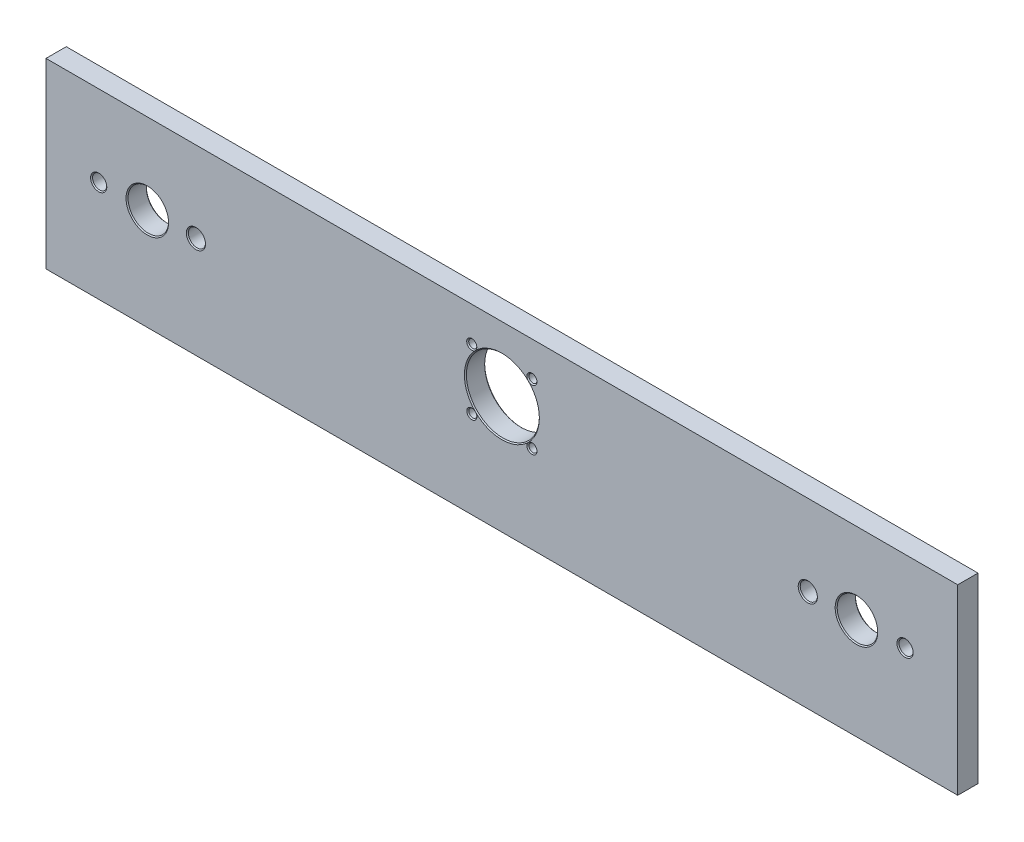
ISO-10303-21;
HEADER;
FILE_DESCRIPTION(('STEP AP214'),'2;1');
FILE_NAME('part.step','',(''),(''),'','','');
FILE_SCHEMA(('AUTOMOTIVE_DESIGN { 1 0 10303 214 1 1 1 1 }'));
ENDSEC;
DATA;
#1=APPLICATION_CONTEXT('core data for automotive mechanical design processes');
#2=APPLICATION_PROTOCOL_DEFINITION('international standard','automotive_design',2000,#1);
#3=PRODUCT_CONTEXT('',#1,'mechanical');
#4=PRODUCT('Part','Part','',(#3));
#5=PRODUCT_RELATED_PRODUCT_CATEGORY('part','',(#4));
#6=PRODUCT_DEFINITION_FORMATION('','',#4);
#7=PRODUCT_DEFINITION_CONTEXT('part definition',#1,'design');
#8=PRODUCT_DEFINITION('design','',#6,#7);
#9=PRODUCT_DEFINITION_SHAPE('','',#8);
#10=(LENGTH_UNIT() NAMED_UNIT(*) SI_UNIT(.MILLI.,.METRE.));
#11=(NAMED_UNIT(*) PLANE_ANGLE_UNIT() SI_UNIT($,.RADIAN.));
#12=(NAMED_UNIT(*) SI_UNIT($,.STERADIAN.) SOLID_ANGLE_UNIT());
#13=UNCERTAINTY_MEASURE_WITH_UNIT(LENGTH_MEASURE(1.E-05),#10,'distance_accuracy_value','');
#14=(GEOMETRIC_REPRESENTATION_CONTEXT(3) GLOBAL_UNCERTAINTY_ASSIGNED_CONTEXT((#13)) GLOBAL_UNIT_ASSIGNED_CONTEXT((#10,
#11,#12)) REPRESENTATION_CONTEXT('',''));
#15=CARTESIAN_POINT('',(0.,0.,0.));
#16=DIRECTION('',(0.,0.,1.));
#17=DIRECTION('',(1.,0.,0.));
#18=AXIS2_PLACEMENT_3D('',#15,#16,#17);
#19=CARTESIAN_POINT('',(0.,0.,10.));
#20=DIRECTION('',(1.,0.,0.));
#21=DIRECTION('',(0.,1.,0.));
#22=AXIS2_PLACEMENT_3D('',#19,#20,#21);
#23=PLANE('',#22);
#24=DIRECTION('',(0.,-1.,0.));
#25=VECTOR('',#24,1.);
#26=CARTESIAN_POINT('',(0.,0.,0.));
#27=LINE('',#26,#25);
#28=CARTESIAN_POINT('',(0.,89.9999999999999,0.));
#29=VERTEX_POINT('',#28);
#30=CARTESIAN_POINT('',(0.,0.,0.));
#31=VERTEX_POINT('',#30);
#32=EDGE_CURVE('E151',#29,#31,#27,.T.);
#33=ORIENTED_EDGE('',*,*,#32,.T.);
#34=DIRECTION('',(0.,0.,-1.));
#35=VECTOR('',#34,1.);
#36=CARTESIAN_POINT('',(0.,0.,10.));
#37=LINE('',#36,#35);
#38=CARTESIAN_POINT('',(0.,0.,10.));
#39=VERTEX_POINT('',#38);
#40=EDGE_CURVE('E132',#39,#31,#37,.T.);
#41=ORIENTED_EDGE('',*,*,#40,.F.);
#42=DIRECTION('',(0.,-1.,0.));
#43=VECTOR('',#42,1.);
#44=CARTESIAN_POINT('',(0.,0.,10.));
#45=LINE('',#44,#43);
#46=CARTESIAN_POINT('',(0.,89.9999999999999,10.));
#47=VERTEX_POINT('',#46);
#48=EDGE_CURVE('E139',#47,#39,#45,.T.);
#49=ORIENTED_EDGE('',*,*,#48,.F.);
#50=DIRECTION('',(0.,0.,-1.));
#51=VECTOR('',#50,1.);
#52=CARTESIAN_POINT('',(0.,89.9999999999999,10.));
#53=LINE('',#52,#51);
#54=EDGE_CURVE('E436',#47,#29,#53,.T.);
#55=ORIENTED_EDGE('',*,*,#54,.T.);
#56=EDGE_LOOP('',(#33,#41,#49,#55));
#57=FACE_BOUND('',#56,.T.);
#58=ADVANCED_FACE('F32',(#57),#23,.F.);
#59=CARTESIAN_POINT('',(0.,0.,10.));
#60=DIRECTION('',(0.,1.,0.));
#61=DIRECTION('',(-1.,0.,0.));
#62=AXIS2_PLACEMENT_3D('',#59,#60,#61);
#63=PLANE('',#62);
#64=DIRECTION('',(1.,0.,0.));
#65=VECTOR('',#64,1.);
#66=CARTESIAN_POINT('',(0.,0.,0.));
#67=LINE('',#66,#65);
#68=CARTESIAN_POINT('',(450.,0.,0.));
#69=VERTEX_POINT('',#68);
#70=EDGE_CURVE('E427',#31,#69,#67,.T.);
#71=ORIENTED_EDGE('',*,*,#70,.T.);
#72=DIRECTION('',(0.,0.,-1.));
#73=VECTOR('',#72,1.);
#74=CARTESIAN_POINT('',(450.,0.,10.));
#75=LINE('',#74,#73);
#76=CARTESIAN_POINT('',(450.,0.,10.));
#77=VERTEX_POINT('',#76);
#78=EDGE_CURVE('E135',#77,#69,#75,.T.);
#79=ORIENTED_EDGE('',*,*,#78,.F.);
#80=DIRECTION('',(1.,0.,0.));
#81=VECTOR('',#80,1.);
#82=CARTESIAN_POINT('',(0.,0.,10.));
#83=LINE('',#82,#81);
#84=EDGE_CURVE('E128',#39,#77,#83,.T.);
#85=ORIENTED_EDGE('',*,*,#84,.F.);
#86=ORIENTED_EDGE('',*,*,#40,.T.);
#87=EDGE_LOOP('',(#71,#79,#85,#86));
#88=FACE_BOUND('',#87,.T.);
#89=ADVANCED_FACE('F130',(#88),#63,.F.);
#90=CARTESIAN_POINT('',(450.,0.,10.));
#91=DIRECTION('',(-1.,0.,0.));
#92=DIRECTION('',(0.,-1.,0.));
#93=AXIS2_PLACEMENT_3D('',#90,#91,#92);
#94=PLANE('',#93);
#95=DIRECTION('',(0.,1.,0.));
#96=VECTOR('',#95,1.);
#97=CARTESIAN_POINT('',(450.,0.,0.));
#98=LINE('',#97,#96);
#99=CARTESIAN_POINT('',(450.,90.0000000000001,0.));
#100=VERTEX_POINT('',#99);
#101=EDGE_CURVE('E429',#69,#100,#98,.T.);
#102=ORIENTED_EDGE('',*,*,#101,.T.);
#103=DIRECTION('',(0.,0.,-1.));
#104=VECTOR('',#103,1.);
#105=CARTESIAN_POINT('',(450.,90.0000000000001,10.));
#106=LINE('',#105,#104);
#107=CARTESIAN_POINT('',(450.,90.0000000000001,10.));
#108=VERTEX_POINT('',#107);
#109=EDGE_CURVE('E156',#108,#100,#106,.T.);
#110=ORIENTED_EDGE('',*,*,#109,.F.);
#111=DIRECTION('',(0.,1.,0.));
#112=VECTOR('',#111,1.);
#113=CARTESIAN_POINT('',(450.,0.,10.));
#114=LINE('',#113,#112);
#115=EDGE_CURVE('E138',#77,#108,#114,.T.);
#116=ORIENTED_EDGE('',*,*,#115,.F.);
#117=ORIENTED_EDGE('',*,*,#78,.T.);
#118=EDGE_LOOP('',(#102,#110,#116,#117));
#119=FACE_BOUND('',#118,.T.);
#120=ADVANCED_FACE('F341',(#119),#94,.F.);
#121=CARTESIAN_POINT('',(0.,89.9999999999999,10.));
#122=DIRECTION('',(0.,-1.,0.));
#123=DIRECTION('',(1.,0.,0.));
#124=AXIS2_PLACEMENT_3D('',#121,#122,#123);
#125=PLANE('',#124);
#126=DIRECTION('',(-1.,0.,0.));
#127=VECTOR('',#126,1.);
#128=CARTESIAN_POINT('',(0.,89.9999999999999,0.));
#129=LINE('',#128,#127);
#130=EDGE_CURVE('E148',#100,#29,#129,.T.);
#131=ORIENTED_EDGE('',*,*,#130,.T.);
#132=ORIENTED_EDGE('',*,*,#54,.F.);
#133=DIRECTION('',(-1.,0.,0.));
#134=VECTOR('',#133,1.);
#135=CARTESIAN_POINT('',(0.,89.9999999999999,10.));
#136=LINE('',#135,#134);
#137=EDGE_CURVE('E144',#108,#47,#136,.T.);
#138=ORIENTED_EDGE('',*,*,#137,.F.);
#139=ORIENTED_EDGE('',*,*,#109,.T.);
#140=EDGE_LOOP('',(#131,#132,#138,#139));
#141=FACE_BOUND('',#140,.T.);
#142=ADVANCED_FACE('F440',(#141),#125,.F.);
#143=CARTESIAN_POINT('',(0.,0.,10.));
#144=DIRECTION('',(0.,0.,-1.));
#145=DIRECTION('',(-1.,0.,0.));
#146=AXIS2_PLACEMENT_3D('',#143,#144,#145);
#147=PLANE('',#146);
#148=CARTESIAN_POINT('',(26.,49.9999999999999,10.));
#149=DIRECTION('',(0.,0.,-1.));
#150=DIRECTION('',(-1.,0.,0.));
#151=AXIS2_PLACEMENT_3D('',#148,#149,#150);
#152=CIRCLE('',#151,3.99999999999995);
#153=CARTESIAN_POINT('',(22.0000000000001,49.9999999999999,10.));
#154=VERTEX_POINT('',#153);
#155=EDGE_CURVE('E270',#154,#154,#152,.T.);
#156=ORIENTED_EDGE('',*,*,#155,.T.);
#157=EDGE_LOOP('',(#156));
#158=FACE_BOUND('',#157,.T.);
#159=CARTESIAN_POINT('',(424.,50.,10.));
#160=DIRECTION('',(0.,0.,-1.));
#161=DIRECTION('',(-1.,0.,0.));
#162=AXIS2_PLACEMENT_3D('',#159,#160,#161);
#163=CIRCLE('',#162,3.99999999999995);
#164=CARTESIAN_POINT('',(420.,50.,10.));
#165=VERTEX_POINT('',#164);
#166=EDGE_CURVE('E267',#165,#165,#163,.T.);
#167=ORIENTED_EDGE('',*,*,#166,.T.);
#168=EDGE_LOOP('',(#167));
#169=FACE_BOUND('',#168,.T.);
#170=CARTESIAN_POINT('',(400.,50.,10.));
#171=DIRECTION('',(0.,0.,-1.));
#172=DIRECTION('',(-1.,0.,0.));
#173=AXIS2_PLACEMENT_3D('',#170,#171,#172);
#174=CIRCLE('',#173,10.5000000000001);
#175=CARTESIAN_POINT('',(389.5,50.,10.));
#176=VERTEX_POINT('',#175);
#177=EDGE_CURVE('E264',#176,#176,#174,.T.);
#178=ORIENTED_EDGE('',*,*,#177,.T.);
#179=EDGE_LOOP('',(#178));
#180=FACE_BOUND('',#179,.T.);
#181=CARTESIAN_POINT('',(376.,50.,10.));
#182=DIRECTION('',(0.,0.,-1.));
#183=DIRECTION('',(-1.,0.,0.));
#184=AXIS2_PLACEMENT_3D('',#181,#182,#183);
#185=CIRCLE('',#184,4.73464127935641);
#186=CARTESIAN_POINT('',(371.265358720644,50.,10.));
#187=VERTEX_POINT('',#186);
#188=EDGE_CURVE('E261',#187,#187,#185,.T.);
#189=ORIENTED_EDGE('',*,*,#188,.T.);
#190=EDGE_LOOP('',(#189));
#191=FACE_BOUND('',#190,.T.);
#192=CARTESIAN_POINT('',(74.,49.9999999999999,10.));
#193=DIRECTION('',(0.,0.,-1.));
#194=DIRECTION('',(-1.,0.,0.));
#195=AXIS2_PLACEMENT_3D('',#192,#193,#194);
#196=CIRCLE('',#195,4.73464127935641);
#197=CARTESIAN_POINT('',(69.2653587206436,49.9999999999999,10.));
#198=VERTEX_POINT('',#197);
#199=EDGE_CURVE('E258',#198,#198,#196,.T.);
#200=ORIENTED_EDGE('',*,*,#199,.T.);
#201=EDGE_LOOP('',(#200));
#202=FACE_BOUND('',#201,.T.);
#203=CARTESIAN_POINT('',(50.,49.9999999999999,10.));
#204=DIRECTION('',(0.,0.,-1.));
#205=DIRECTION('',(-1.,0.,0.));
#206=AXIS2_PLACEMENT_3D('',#203,#204,#205);
#207=CIRCLE('',#206,10.5000000000001);
#208=CARTESIAN_POINT('',(39.5,49.9999999999999,10.));
#209=VERTEX_POINT('',#208);
#210=EDGE_CURVE('E255',#209,#209,#207,.T.);
#211=ORIENTED_EDGE('',*,*,#210,.T.);
#212=EDGE_LOOP('',(#211));
#213=FACE_BOUND('',#212,.T.);
#214=CARTESIAN_POINT('',(239.838503544338,72.8599735048443,10.));
#215=DIRECTION('',(0.,0.,-1.));
#216=DIRECTION('',(-1.,0.,0.));
#217=AXIS2_PLACEMENT_3D('',#214,#215,#216);
#218=CIRCLE('',#217,2.5);
#219=CARTESIAN_POINT('',(238.072015027155,71.0909290399819,10.));
#220=VERTEX_POINT('',#219);
#221=CARTESIAN_POINT('',(242.338503544338,72.8599735048443,10.));
#222=VERTEX_POINT('',#221);
#223=EDGE_CURVE('E47',#220,#222,#218,.T.);
#224=ORIENTED_EDGE('',*,*,#223,.T.);
#225=CARTESIAN_POINT('',(239.838503544338,72.8599735048443,10.));
#226=DIRECTION('',(0.,0.,-1.));
#227=DIRECTION('',(-1.,0.,0.));
#228=AXIS2_PLACEMENT_3D('',#225,#226,#227);
#229=CIRCLE('',#228,2.5);
#230=EDGE_CURVE('E241',#222,#220,#229,.T.);
#231=ORIENTED_EDGE('',*,*,#230,.T.);
#232=CARTESIAN_POINT('',(225.,57.9999999999999,10.));
#233=DIRECTION('',(0.,0.,-1.));
#234=DIRECTION('',(-1.,0.,0.));
#235=AXIS2_PLACEMENT_3D('',#232,#233,#234);
#236=CIRCLE('',#235,18.5000000000001);
#237=CARTESIAN_POINT('',(243.5,57.9999999999999,10.));
#238=VERTEX_POINT('',#237);
#239=EDGE_CURVE('E215',#220,#238,#236,.T.);
#240=ORIENTED_EDGE('',*,*,#239,.T.);
#241=CARTESIAN_POINT('',(225.,57.9999999999999,10.));
#242=DIRECTION('',(0.,0.,-1.));
#243=DIRECTION('',(-1.,0.,0.));
#244=AXIS2_PLACEMENT_3D('',#241,#242,#243);
#245=CIRCLE('',#244,18.5000000000001);
#246=CARTESIAN_POINT('',(238.090929039982,44.9279849728453,10.));
#247=VERTEX_POINT('',#246);
#248=EDGE_CURVE('E224',#238,#247,#245,.T.);
#249=ORIENTED_EDGE('',*,*,#248,.T.);
#250=CARTESIAN_POINT('',(239.859973504844,43.1614964556623,10.));
#251=DIRECTION('',(0.,0.,-1.));
#252=DIRECTION('',(-1.,0.,0.));
#253=AXIS2_PLACEMENT_3D('',#250,#251,#252);
#254=CIRCLE('',#253,2.5);
#255=CARTESIAN_POINT('',(242.359973504844,43.1614964556623,10.));
#256=VERTEX_POINT('',#255);
#257=EDGE_CURVE('E227',#247,#256,#254,.T.);
#258=ORIENTED_EDGE('',*,*,#257,.T.);
#259=CARTESIAN_POINT('',(239.859973504844,43.1614964556623,10.));
#260=DIRECTION('',(0.,0.,-1.));
#261=DIRECTION('',(-1.,0.,0.));
#262=AXIS2_PLACEMENT_3D('',#259,#260,#261);
#263=CIRCLE('',#262,2.5);
#264=EDGE_CURVE('E229',#256,#247,#263,.T.);
#265=ORIENTED_EDGE('',*,*,#264,.T.);
#266=CARTESIAN_POINT('',(225.,57.9999999999999,10.));
#267=DIRECTION('',(0.,0.,-1.));
#268=DIRECTION('',(-1.,0.,0.));
#269=AXIS2_PLACEMENT_3D('',#266,#267,#268);
#270=CIRCLE('',#269,18.5000000000001);
#271=CARTESIAN_POINT('',(211.927984972845,44.909070960018,10.));
#272=VERTEX_POINT('',#271);
#273=EDGE_CURVE('E222',#247,#272,#270,.T.);
#274=ORIENTED_EDGE('',*,*,#273,.T.);
#275=CARTESIAN_POINT('',(210.161496455662,43.1400264951555,10.));
#276=DIRECTION('',(0.,0.,-1.));
#277=DIRECTION('',(-1.,0.,0.));
#278=AXIS2_PLACEMENT_3D('',#275,#276,#277);
#279=CIRCLE('',#278,2.5);
#280=CARTESIAN_POINT('',(212.661496455662,43.1400264951555,10.));
#281=VERTEX_POINT('',#280);
#282=EDGE_CURVE('E54',#272,#281,#279,.T.);
#283=ORIENTED_EDGE('',*,*,#282,.T.);
#284=CARTESIAN_POINT('',(210.161496455662,43.1400264951555,10.));
#285=DIRECTION('',(0.,0.,-1.));
#286=DIRECTION('',(-1.,0.,0.));
#287=AXIS2_PLACEMENT_3D('',#284,#285,#286);
#288=CIRCLE('',#287,2.5);
#289=EDGE_CURVE('E238',#281,#272,#288,.T.);
#290=ORIENTED_EDGE('',*,*,#289,.T.);
#291=CARTESIAN_POINT('',(225.,57.9999999999999,10.));
#292=DIRECTION('',(0.,0.,-1.));
#293=DIRECTION('',(-1.,0.,0.));
#294=AXIS2_PLACEMENT_3D('',#291,#292,#293);
#295=CIRCLE('',#294,18.5000000000001);
#296=CARTESIAN_POINT('',(211.909070960018,71.0720150271546,10.));
#297=VERTEX_POINT('',#296);
#298=EDGE_CURVE('E219',#272,#297,#295,.T.);
#299=ORIENTED_EDGE('',*,*,#298,.T.);
#300=CARTESIAN_POINT('',(210.140026495156,72.8385035443376,10.));
#301=DIRECTION('',(0.,0.,-1.));
#302=DIRECTION('',(-1.,0.,0.));
#303=AXIS2_PLACEMENT_3D('',#300,#301,#302);
#304=CIRCLE('',#303,2.5);
#305=CARTESIAN_POINT('',(212.640026495156,72.8385035443376,10.));
#306=VERTEX_POINT('',#305);
#307=EDGE_CURVE('E232',#297,#306,#304,.T.);
#308=ORIENTED_EDGE('',*,*,#307,.T.);
#309=CARTESIAN_POINT('',(210.140026495156,72.8385035443376,10.));
#310=DIRECTION('',(0.,0.,-1.));
#311=DIRECTION('',(-1.,0.,0.));
#312=AXIS2_PLACEMENT_3D('',#309,#310,#311);
#313=CIRCLE('',#312,2.5);
#314=EDGE_CURVE('E234',#306,#297,#313,.T.);
#315=ORIENTED_EDGE('',*,*,#314,.T.);
#316=CARTESIAN_POINT('',(225.,57.9999999999999,10.));
#317=DIRECTION('',(0.,0.,-1.));
#318=DIRECTION('',(-1.,0.,0.));
#319=AXIS2_PLACEMENT_3D('',#316,#317,#318);
#320=CIRCLE('',#319,18.5000000000001);
#321=EDGE_CURVE('E217',#297,#220,#320,.T.);
#322=ORIENTED_EDGE('',*,*,#321,.T.);
#323=EDGE_LOOP('',(#224,#231,#240,#249,#258,#265,#274,#283,#290,#299,#308,#315,#322));
#324=FACE_BOUND('',#323,.T.);
#325=ORIENTED_EDGE('',*,*,#48,.T.);
#326=ORIENTED_EDGE('',*,*,#84,.T.);
#327=ORIENTED_EDGE('',*,*,#115,.T.);
#328=ORIENTED_EDGE('',*,*,#137,.T.);
#329=EDGE_LOOP('',(#325,#326,#327,#328));
#330=FACE_BOUND('',#329,.T.);
#331=ADVANCED_FACE('F142',(#158,#169,#180,#191,#202,#213,#324,#330),#147,.F.);
#332=CARTESIAN_POINT('',(0.,0.,0.));
#333=DIRECTION('',(0.,0.,-1.));
#334=DIRECTION('',(-1.,0.,0.));
#335=AXIS2_PLACEMENT_3D('',#332,#333,#334);
#336=PLANE('',#335);
#337=CARTESIAN_POINT('',(26.,49.9999999999999,0.));
#338=DIRECTION('',(0.,0.,-1.));
#339=DIRECTION('',(-1.,0.,0.));
#340=AXIS2_PLACEMENT_3D('',#337,#338,#339);
#341=CIRCLE('',#340,3.99999999999989);
#342=CARTESIAN_POINT('',(22.0000000000002,49.9999999999999,0.));
#343=VERTEX_POINT('',#342);
#344=EDGE_CURVE('E288',#343,#343,#341,.F.);
#345=ORIENTED_EDGE('',*,*,#344,.T.);
#346=EDGE_LOOP('',(#345));
#347=FACE_BOUND('',#346,.T.);
#348=CARTESIAN_POINT('',(50.,49.9999999999999,0.));
#349=DIRECTION('',(0.,0.,-1.));
#350=DIRECTION('',(-1.,0.,0.));
#351=AXIS2_PLACEMENT_3D('',#348,#349,#350);
#352=CIRCLE('',#351,10.5);
#353=CARTESIAN_POINT('',(39.5,49.9999999999999,0.));
#354=VERTEX_POINT('',#353);
#355=EDGE_CURVE('E285',#354,#354,#352,.F.);
#356=ORIENTED_EDGE('',*,*,#355,.T.);
#357=EDGE_LOOP('',(#356));
#358=FACE_BOUND('',#357,.T.);
#359=CARTESIAN_POINT('',(74.,49.9999999999999,0.));
#360=DIRECTION('',(0.,0.,-1.));
#361=DIRECTION('',(-1.,0.,0.));
#362=AXIS2_PLACEMENT_3D('',#359,#360,#361);
#363=CIRCLE('',#362,4.73464127935647);
#364=CARTESIAN_POINT('',(69.2653587206436,49.9999999999999,0.));
#365=VERTEX_POINT('',#364);
#366=EDGE_CURVE('E282',#365,#365,#363,.F.);
#367=ORIENTED_EDGE('',*,*,#366,.T.);
#368=EDGE_LOOP('',(#367));
#369=FACE_BOUND('',#368,.T.);
#370=CARTESIAN_POINT('',(376.,50.,0.));
#371=DIRECTION('',(0.,0.,-1.));
#372=DIRECTION('',(-1.,0.,0.));
#373=AXIS2_PLACEMENT_3D('',#370,#371,#372);
#374=CIRCLE('',#373,4.73464127935641);
#375=CARTESIAN_POINT('',(371.265358720644,50.,0.));
#376=VERTEX_POINT('',#375);
#377=EDGE_CURVE('E279',#376,#376,#374,.F.);
#378=ORIENTED_EDGE('',*,*,#377,.T.);
#379=EDGE_LOOP('',(#378));
#380=FACE_BOUND('',#379,.T.);
#381=CARTESIAN_POINT('',(400.,50.,0.));
#382=DIRECTION('',(0.,0.,-1.));
#383=DIRECTION('',(-1.,0.,0.));
#384=AXIS2_PLACEMENT_3D('',#381,#382,#383);
#385=CIRCLE('',#384,10.5000000000001);
#386=CARTESIAN_POINT('',(389.5,50.,0.));
#387=VERTEX_POINT('',#386);
#388=EDGE_CURVE('E276',#387,#387,#385,.F.);
#389=ORIENTED_EDGE('',*,*,#388,.T.);
#390=EDGE_LOOP('',(#389));
#391=FACE_BOUND('',#390,.T.);
#392=CARTESIAN_POINT('',(424.,50.,0.));
#393=DIRECTION('',(0.,0.,-1.));
#394=DIRECTION('',(-1.,0.,0.));
#395=AXIS2_PLACEMENT_3D('',#392,#393,#394);
#396=CIRCLE('',#395,4.);
#397=CARTESIAN_POINT('',(420.,50.,0.));
#398=VERTEX_POINT('',#397);
#399=EDGE_CURVE('E273',#398,#398,#396,.F.);
#400=ORIENTED_EDGE('',*,*,#399,.T.);
#401=EDGE_LOOP('',(#400));
#402=FACE_BOUND('',#401,.T.);
#403=CARTESIAN_POINT('',(239.859973504844,43.1614964556623,0.));
#404=DIRECTION('',(0.,0.,-1.));
#405=DIRECTION('',(-1.,0.,0.));
#406=AXIS2_PLACEMENT_3D('',#403,#404,#405);
#407=CIRCLE('',#406,2.50000000000006);
#408=CARTESIAN_POINT('',(238.090929039982,44.9279849728454,0.));
#409=VERTEX_POINT('',#408);
#410=CARTESIAN_POINT('',(242.359973504844,43.1614964556623,0.));
#411=VERTEX_POINT('',#410);
#412=EDGE_CURVE('E186',#409,#411,#407,.F.);
#413=ORIENTED_EDGE('',*,*,#412,.T.);
#414=CARTESIAN_POINT('',(239.859973504844,43.1614964556623,0.));
#415=DIRECTION('',(0.,0.,-1.));
#416=DIRECTION('',(-1.,0.,0.));
#417=AXIS2_PLACEMENT_3D('',#414,#415,#416);
#418=CIRCLE('',#417,2.50000000000006);
#419=EDGE_CURVE('E188',#411,#409,#418,.F.);
#420=ORIENTED_EDGE('',*,*,#419,.T.);
#421=CARTESIAN_POINT('',(225.,57.9999999999999,0.));
#422=DIRECTION('',(0.,0.,-1.));
#423=DIRECTION('',(-1.,0.,0.));
#424=AXIS2_PLACEMENT_3D('',#421,#422,#423);
#425=CIRCLE('',#424,18.5);
#426=CARTESIAN_POINT('',(243.5,57.9999999999999,0.));
#427=VERTEX_POINT('',#426);
#428=EDGE_CURVE('E152',#409,#427,#425,.F.);
#429=ORIENTED_EDGE('',*,*,#428,.T.);
#430=CARTESIAN_POINT('',(225.,57.9999999999999,0.));
#431=DIRECTION('',(0.,0.,-1.));
#432=DIRECTION('',(-1.,0.,0.));
#433=AXIS2_PLACEMENT_3D('',#430,#431,#432);
#434=CIRCLE('',#433,18.5);
#435=CARTESIAN_POINT('',(238.072015027155,71.0909290399819,0.));
#436=VERTEX_POINT('',#435);
#437=EDGE_CURVE('E168',#427,#436,#434,.F.);
#438=ORIENTED_EDGE('',*,*,#437,.T.);
#439=CARTESIAN_POINT('',(239.838503544338,72.8599735048443,0.));
#440=DIRECTION('',(0.,0.,-1.));
#441=DIRECTION('',(-1.,0.,0.));
#442=AXIS2_PLACEMENT_3D('',#439,#440,#441);
#443=CIRCLE('',#442,2.49999999999995);
#444=CARTESIAN_POINT('',(242.338503544338,72.8599735048443,0.));
#445=VERTEX_POINT('',#444);
#446=EDGE_CURVE('E171',#436,#445,#443,.F.);
#447=ORIENTED_EDGE('',*,*,#446,.T.);
#448=CARTESIAN_POINT('',(239.838503544338,72.8599735048443,0.));
#449=DIRECTION('',(0.,0.,-1.));
#450=DIRECTION('',(-1.,0.,0.));
#451=AXIS2_PLACEMENT_3D('',#448,#449,#450);
#452=CIRCLE('',#451,2.49999999999995);
#453=EDGE_CURVE('E173',#445,#436,#452,.F.);
#454=ORIENTED_EDGE('',*,*,#453,.T.);
#455=CARTESIAN_POINT('',(225.,57.9999999999999,0.));
#456=DIRECTION('',(0.,0.,-1.));
#457=DIRECTION('',(-1.,0.,0.));
#458=AXIS2_PLACEMENT_3D('',#455,#456,#457);
#459=CIRCLE('',#458,18.5);
#460=CARTESIAN_POINT('',(211.909070960018,71.0720150271545,0.));
#461=VERTEX_POINT('',#460);
#462=EDGE_CURVE('E165',#436,#461,#459,.F.);
#463=ORIENTED_EDGE('',*,*,#462,.T.);
#464=CARTESIAN_POINT('',(210.140026495156,72.8385035443376,0.));
#465=DIRECTION('',(0.,0.,-1.));
#466=DIRECTION('',(-1.,0.,0.));
#467=AXIS2_PLACEMENT_3D('',#464,#465,#466);
#468=CIRCLE('',#467,2.50000000000006);
#469=CARTESIAN_POINT('',(212.640026495156,72.8385035443376,0.));
#470=VERTEX_POINT('',#469);
#471=EDGE_CURVE('E176',#461,#470,#468,.F.);
#472=ORIENTED_EDGE('',*,*,#471,.T.);
#473=CARTESIAN_POINT('',(210.140026495156,72.8385035443376,0.));
#474=DIRECTION('',(0.,0.,-1.));
#475=DIRECTION('',(-1.,0.,0.));
#476=AXIS2_PLACEMENT_3D('',#473,#474,#475);
#477=CIRCLE('',#476,2.50000000000006);
#478=EDGE_CURVE('E178',#470,#461,#477,.F.);
#479=ORIENTED_EDGE('',*,*,#478,.T.);
#480=CARTESIAN_POINT('',(225.,57.9999999999999,0.));
#481=DIRECTION('',(0.,0.,-1.));
#482=DIRECTION('',(-1.,0.,0.));
#483=AXIS2_PLACEMENT_3D('',#480,#481,#482);
#484=CIRCLE('',#483,18.5);
#485=CARTESIAN_POINT('',(211.927984972845,44.9090709600179,0.));
#486=VERTEX_POINT('',#485);
#487=EDGE_CURVE('E162',#461,#486,#484,.F.);
#488=ORIENTED_EDGE('',*,*,#487,.T.);
#489=CARTESIAN_POINT('',(210.161496455662,43.1400264951555,0.));
#490=DIRECTION('',(0.,0.,-1.));
#491=DIRECTION('',(-1.,0.,0.));
#492=AXIS2_PLACEMENT_3D('',#489,#490,#491);
#493=CIRCLE('',#492,2.49999999999995);
#494=CARTESIAN_POINT('',(212.661496455662,43.1400264951555,0.));
#495=VERTEX_POINT('',#494);
#496=EDGE_CURVE('E181',#486,#495,#493,.F.);
#497=ORIENTED_EDGE('',*,*,#496,.T.);
#498=CARTESIAN_POINT('',(210.161496455662,43.1400264951555,0.));
#499=DIRECTION('',(0.,0.,-1.));
#500=DIRECTION('',(-1.,0.,0.));
#501=AXIS2_PLACEMENT_3D('',#498,#499,#500);
#502=CIRCLE('',#501,2.49999999999995);
#503=EDGE_CURVE('E183',#495,#486,#502,.F.);
#504=ORIENTED_EDGE('',*,*,#503,.T.);
#505=CARTESIAN_POINT('',(225.,57.9999999999999,0.));
#506=DIRECTION('',(0.,0.,-1.));
#507=DIRECTION('',(-1.,0.,0.));
#508=AXIS2_PLACEMENT_3D('',#505,#506,#507);
#509=CIRCLE('',#508,18.5);
#510=EDGE_CURVE('E154',#486,#409,#509,.F.);
#511=ORIENTED_EDGE('',*,*,#510,.T.);
#512=EDGE_LOOP('',(#413,#420,#429,#438,#447,#454,#463,#472,#479,#488,#497,#504,#511));
#513=FACE_BOUND('',#512,.T.);
#514=ORIENTED_EDGE('',*,*,#32,.F.);
#515=ORIENTED_EDGE('',*,*,#130,.F.);
#516=ORIENTED_EDGE('',*,*,#101,.F.);
#517=ORIENTED_EDGE('',*,*,#70,.F.);
#518=EDGE_LOOP('',(#514,#515,#516,#517));
#519=FACE_BOUND('',#518,.T.);
#520=ADVANCED_FACE('F415',(#347,#358,#369,#380,#391,#402,#513,#519),#336,.T.);
#521=CARTESIAN_POINT('',(225.,57.9999999999999,0.));
#522=DIRECTION('',(0.,0.,1.));
#523=DIRECTION('',(1.,0.,0.));
#524=AXIS2_PLACEMENT_3D('',#521,#522,#523);
#525=CYLINDRICAL_SURFACE('',#524,18.);
#526=CARTESIAN_POINT('',(225.,57.9999999999999,9.49999999999991));
#527=DIRECTION('',(0.,0.,-1.));
#528=DIRECTION('',(-1.,0.,0.));
#529=AXIS2_PLACEMENT_3D('',#526,#527,#528);
#530=CIRCLE('',#529,18.);
#531=CARTESIAN_POINT('',(207.,57.9999999999999,9.49999999999991));
#532=VERTEX_POINT('',#531);
#533=EDGE_CURVE('E246',#532,#532,#530,.F.);
#534=ORIENTED_EDGE('',*,*,#533,.T.);
#535=EDGE_LOOP('',(#534));
#536=FACE_BOUND('',#535,.T.);
#537=CARTESIAN_POINT('',(225.,57.9999999999999,0.499999999999976));
#538=DIRECTION('',(0.,0.,-1.));
#539=DIRECTION('',(-1.,0.,0.));
#540=AXIS2_PLACEMENT_3D('',#537,#538,#539);
#541=CIRCLE('',#540,18.);
#542=CARTESIAN_POINT('',(207.,57.9999999999999,0.499999999999976));
#543=VERTEX_POINT('',#542);
#544=EDGE_CURVE('E243',#543,#543,#541,.T.);
#545=ORIENTED_EDGE('',*,*,#544,.T.);
#546=EDGE_LOOP('',(#545));
#547=FACE_BOUND('',#546,.T.);
#548=ADVANCED_FACE('F418',(#536,#547),#525,.F.);
#549=CARTESIAN_POINT('',(210.140026495156,72.8385035443376,0.));
#550=DIRECTION('',(0.,0.,1.));
#551=DIRECTION('',(1.,0.,0.));
#552=AXIS2_PLACEMENT_3D('',#549,#550,#551);
#553=CYLINDRICAL_SURFACE('',#552,2.);
#554=CARTESIAN_POINT('',(210.140026495156,72.8385035443376,0.500000000000013));
#555=DIRECTION('',(0.,0.,-1.));
#556=DIRECTION('',(-1.,0.,0.));
#557=AXIS2_PLACEMENT_3D('',#554,#555,#556);
#558=CIRCLE('',#557,2.);
#559=CARTESIAN_POINT('',(208.140026495156,72.8385035443376,0.500000000000013));
#560=VERTEX_POINT('',#559);
#561=EDGE_CURVE('E212',#560,#560,#558,.T.);
#562=ORIENTED_EDGE('',*,*,#561,.T.);
#563=EDGE_LOOP('',(#562));
#564=FACE_BOUND('',#563,.T.);
#565=CARTESIAN_POINT('',(210.140026495156,72.8385035443376,9.50000000000004));
#566=DIRECTION('',(0.,0.,-1.));
#567=DIRECTION('',(-1.,0.,0.));
#568=AXIS2_PLACEMENT_3D('',#565,#566,#567);
#569=CIRCLE('',#568,2.);
#570=CARTESIAN_POINT('',(208.140026495156,72.8385035443376,9.50000000000004));
#571=VERTEX_POINT('',#570);
#572=EDGE_CURVE('E209',#571,#571,#569,.F.);
#573=ORIENTED_EDGE('',*,*,#572,.T.);
#574=EDGE_LOOP('',(#573));
#575=FACE_BOUND('',#574,.T.);
#576=ADVANCED_FACE('F453',(#564,#575),#553,.F.);
#577=CARTESIAN_POINT('',(239.838503544338,72.8599735048443,0.));
#578=DIRECTION('',(0.,0.,1.));
#579=DIRECTION('',(1.,0.,0.));
#580=AXIS2_PLACEMENT_3D('',#577,#578,#579);
#581=CYLINDRICAL_SURFACE('',#580,2.);
#582=CARTESIAN_POINT('',(239.838503544338,72.8599735048443,0.499999999999902));
#583=DIRECTION('',(0.,0.,-1.));
#584=DIRECTION('',(-1.,0.,0.));
#585=AXIS2_PLACEMENT_3D('',#582,#583,#584);
#586=CIRCLE('',#585,2.);
#587=CARTESIAN_POINT('',(237.838503544338,72.8599735048443,0.499999999999902));
#588=VERTEX_POINT('',#587);
#589=EDGE_CURVE('E206',#588,#588,#586,.T.);
#590=ORIENTED_EDGE('',*,*,#589,.T.);
#591=EDGE_LOOP('',(#590));
#592=FACE_BOUND('',#591,.T.);
#593=CARTESIAN_POINT('',(239.838503544338,72.8599735048443,9.50000000000004));
#594=DIRECTION('',(0.,0.,-1.));
#595=DIRECTION('',(-1.,0.,0.));
#596=AXIS2_PLACEMENT_3D('',#593,#594,#595);
#597=CIRCLE('',#596,2.);
#598=CARTESIAN_POINT('',(237.838503544338,72.8599735048443,9.50000000000004));
#599=VERTEX_POINT('',#598);
#600=EDGE_CURVE('E203',#599,#599,#597,.F.);
#601=ORIENTED_EDGE('',*,*,#600,.T.);
#602=EDGE_LOOP('',(#601));
#603=FACE_BOUND('',#602,.T.);
#604=ADVANCED_FACE('F457',(#592,#603),#581,.F.);
#605=CARTESIAN_POINT('',(239.859973504844,43.1614964556623,0.));
#606=DIRECTION('',(0.,0.,1.));
#607=DIRECTION('',(1.,0.,0.));
#608=AXIS2_PLACEMENT_3D('',#605,#606,#607);
#609=CYLINDRICAL_SURFACE('',#608,2.);
#610=CARTESIAN_POINT('',(239.859973504844,43.1614964556623,0.500000000000013));
#611=DIRECTION('',(0.,0.,-1.));
#612=DIRECTION('',(-1.,0.,0.));
#613=AXIS2_PLACEMENT_3D('',#610,#611,#612);
#614=CIRCLE('',#613,2.);
#615=CARTESIAN_POINT('',(237.859973504844,43.1614964556623,0.500000000000013));
#616=VERTEX_POINT('',#615);
#617=EDGE_CURVE('E194',#616,#616,#614,.T.);
#618=ORIENTED_EDGE('',*,*,#617,.T.);
#619=EDGE_LOOP('',(#618));
#620=FACE_BOUND('',#619,.T.);
#621=CARTESIAN_POINT('',(239.859973504844,43.1614964556623,9.50000000000004));
#622=DIRECTION('',(0.,0.,-1.));
#623=DIRECTION('',(-1.,0.,0.));
#624=AXIS2_PLACEMENT_3D('',#621,#622,#623);
#625=CIRCLE('',#624,2.);
#626=CARTESIAN_POINT('',(237.859973504844,43.1614964556623,9.50000000000004));
#627=VERTEX_POINT('',#626);
#628=EDGE_CURVE('E191',#627,#627,#625,.F.);
#629=ORIENTED_EDGE('',*,*,#628,.T.);
#630=EDGE_LOOP('',(#629));
#631=FACE_BOUND('',#630,.T.);
#632=ADVANCED_FACE('F461',(#620,#631),#609,.F.);
#633=CARTESIAN_POINT('',(210.161496455662,43.1400264951555,0.));
#634=DIRECTION('',(0.,0.,1.));
#635=DIRECTION('',(1.,0.,0.));
#636=AXIS2_PLACEMENT_3D('',#633,#634,#635);
#637=CYLINDRICAL_SURFACE('',#636,2.00000000000003);
#638=CARTESIAN_POINT('',(210.161496455662,43.1400264951555,0.499999999999873));
#639=DIRECTION('',(0.,0.,-1.));
#640=DIRECTION('',(-1.,0.,0.));
#641=AXIS2_PLACEMENT_3D('',#638,#639,#640);
#642=CIRCLE('',#641,2.00000000000003);
#643=CARTESIAN_POINT('',(208.161496455662,43.1400264951555,0.499999999999873));
#644=VERTEX_POINT('',#643);
#645=EDGE_CURVE('E200',#644,#644,#642,.T.);
#646=ORIENTED_EDGE('',*,*,#645,.T.);
#647=EDGE_LOOP('',(#646));
#648=FACE_BOUND('',#647,.T.);
#649=CARTESIAN_POINT('',(210.161496455662,43.1400264951555,9.50000000000007));
#650=DIRECTION('',(0.,0.,-1.));
#651=DIRECTION('',(-1.,0.,0.));
#652=AXIS2_PLACEMENT_3D('',#649,#650,#651);
#653=CIRCLE('',#652,2.00000000000003);
#654=CARTESIAN_POINT('',(208.161496455662,43.1400264951555,9.50000000000007));
#655=VERTEX_POINT('',#654);
#656=EDGE_CURVE('E197',#655,#655,#653,.F.);
#657=ORIENTED_EDGE('',*,*,#656,.T.);
#658=EDGE_LOOP('',(#657));
#659=FACE_BOUND('',#658,.T.);
#660=ADVANCED_FACE('F349',(#648,#659),#637,.F.);
#661=CARTESIAN_POINT('',(239.859973504844,43.1614964556623,0.));
#662=DIRECTION('',(0.,0.,-1.));
#663=DIRECTION('',(-1.,0.,0.));
#664=AXIS2_PLACEMENT_3D('',#661,#662,#663);
#665=CONICAL_SURFACE('',#664,2.50000000000006,0.785398163397497);
#666=ORIENTED_EDGE('',*,*,#617,.F.);
#667=EDGE_LOOP('',(#666));
#668=FACE_BOUND('',#667,.T.);
#669=ORIENTED_EDGE('',*,*,#412,.F.);
#670=ORIENTED_EDGE('',*,*,#419,.F.);
#671=EDGE_LOOP('',(#669,#670));
#672=FACE_BOUND('',#671,.T.);
#673=ADVANCED_FACE('F345',(#668,#672),#665,.F.);
#674=CARTESIAN_POINT('',(210.161496455662,43.1400264951555,0.));
#675=DIRECTION('',(0.,0.,-1.));
#676=DIRECTION('',(-1.,0.,0.));
#677=AXIS2_PLACEMENT_3D('',#674,#675,#676);
#678=CONICAL_SURFACE('',#677,2.49999999999995,0.785398163397497);
#679=ORIENTED_EDGE('',*,*,#645,.F.);
#680=EDGE_LOOP('',(#679));
#681=FACE_BOUND('',#680,.T.);
#682=ORIENTED_EDGE('',*,*,#496,.F.);
#683=ORIENTED_EDGE('',*,*,#503,.F.);
#684=EDGE_LOOP('',(#682,#683));
#685=FACE_BOUND('',#684,.T.);
#686=ADVANCED_FACE('F348',(#681,#685),#678,.F.);
#687=CARTESIAN_POINT('',(239.838503544338,72.8599735048443,0.));
#688=DIRECTION('',(0.,0.,-1.));
#689=DIRECTION('',(-1.,0.,0.));
#690=AXIS2_PLACEMENT_3D('',#687,#688,#689);
#691=CONICAL_SURFACE('',#690,2.49999999999995,0.785398163397497);
#692=ORIENTED_EDGE('',*,*,#589,.F.);
#693=EDGE_LOOP('',(#692));
#694=FACE_BOUND('',#693,.T.);
#695=ORIENTED_EDGE('',*,*,#446,.F.);
#696=ORIENTED_EDGE('',*,*,#453,.F.);
#697=EDGE_LOOP('',(#695,#696));
#698=FACE_BOUND('',#697,.T.);
#699=ADVANCED_FACE('F353',(#694,#698),#691,.F.);
#700=CARTESIAN_POINT('',(210.140026495156,72.8385035443376,0.));
#701=DIRECTION('',(0.,0.,-1.));
#702=DIRECTION('',(-1.,0.,0.));
#703=AXIS2_PLACEMENT_3D('',#700,#701,#702);
#704=CONICAL_SURFACE('',#703,2.50000000000006,0.785398163397497);
#705=ORIENTED_EDGE('',*,*,#561,.F.);
#706=EDGE_LOOP('',(#705));
#707=FACE_BOUND('',#706,.T.);
#708=ORIENTED_EDGE('',*,*,#471,.F.);
#709=ORIENTED_EDGE('',*,*,#478,.F.);
#710=EDGE_LOOP('',(#708,#709));
#711=FACE_BOUND('',#710,.T.);
#712=ADVANCED_FACE('F357',(#707,#711),#704,.F.);
#713=CARTESIAN_POINT('',(239.859973504844,43.1614964556623,9.50000000000004));
#714=DIRECTION('',(0.,0.,1.));
#715=DIRECTION('',(1.,0.,0.));
#716=AXIS2_PLACEMENT_3D('',#713,#714,#715);
#717=CONICAL_SURFACE('',#716,2.,0.785398163397497);
#718=ORIENTED_EDGE('',*,*,#257,.F.);
#719=ORIENTED_EDGE('',*,*,#264,.F.);
#720=EDGE_LOOP('',(#718,#719));
#721=FACE_BOUND('',#720,.T.);
#722=ORIENTED_EDGE('',*,*,#628,.F.);
#723=EDGE_LOOP('',(#722));
#724=FACE_BOUND('',#723,.T.);
#725=ADVANCED_FACE('F361',(#721,#724),#717,.F.);
#726=CARTESIAN_POINT('',(239.838503544338,72.8599735048443,9.50000000000004));
#727=DIRECTION('',(0.,0.,1.));
#728=DIRECTION('',(1.,0.,0.));
#729=AXIS2_PLACEMENT_3D('',#726,#727,#728);
#730=CONICAL_SURFACE('',#729,2.,0.785398163397497);
#731=ORIENTED_EDGE('',*,*,#223,.F.);
#732=ORIENTED_EDGE('',*,*,#230,.F.);
#733=EDGE_LOOP('',(#731,#732));
#734=FACE_BOUND('',#733,.T.);
#735=ORIENTED_EDGE('',*,*,#600,.F.);
#736=EDGE_LOOP('',(#735));
#737=FACE_BOUND('',#736,.T.);
#738=ADVANCED_FACE('F365',(#734,#737),#730,.F.);
#739=CARTESIAN_POINT('',(210.161496455662,43.1400264951555,9.50000000000007));
#740=DIRECTION('',(0.,0.,1.));
#741=DIRECTION('',(1.,0.,0.));
#742=AXIS2_PLACEMENT_3D('',#739,#740,#741);
#743=CONICAL_SURFACE('',#742,2.00000000000003,0.785398163397498);
#744=ORIENTED_EDGE('',*,*,#282,.F.);
#745=ORIENTED_EDGE('',*,*,#289,.F.);
#746=EDGE_LOOP('',(#744,#745));
#747=FACE_BOUND('',#746,.T.);
#748=ORIENTED_EDGE('',*,*,#656,.F.);
#749=EDGE_LOOP('',(#748));
#750=FACE_BOUND('',#749,.T.);
#751=ADVANCED_FACE('F369',(#747,#750),#743,.F.);
#752=CARTESIAN_POINT('',(210.140026495156,72.8385035443376,9.50000000000004));
#753=DIRECTION('',(0.,0.,1.));
#754=DIRECTION('',(1.,0.,0.));
#755=AXIS2_PLACEMENT_3D('',#752,#753,#754);
#756=CONICAL_SURFACE('',#755,2.,0.785398163397497);
#757=ORIENTED_EDGE('',*,*,#307,.F.);
#758=ORIENTED_EDGE('',*,*,#314,.F.);
#759=EDGE_LOOP('',(#757,#758));
#760=FACE_BOUND('',#759,.T.);
#761=ORIENTED_EDGE('',*,*,#572,.F.);
#762=EDGE_LOOP('',(#761));
#763=FACE_BOUND('',#762,.T.);
#764=ADVANCED_FACE('F373',(#760,#763),#756,.F.);
#765=CARTESIAN_POINT('',(225.,57.9999999999999,9.49999999999991));
#766=DIRECTION('',(0.,0.,1.));
#767=DIRECTION('',(1.,0.,0.));
#768=AXIS2_PLACEMENT_3D('',#765,#766,#767);
#769=CONICAL_SURFACE('',#768,18.,0.785398163397441);
#770=ORIENTED_EDGE('',*,*,#273,.F.);
#771=ORIENTED_EDGE('',*,*,#248,.F.);
#772=ORIENTED_EDGE('',*,*,#239,.F.);
#773=ORIENTED_EDGE('',*,*,#321,.F.);
#774=ORIENTED_EDGE('',*,*,#298,.F.);
#775=EDGE_LOOP('',(#770,#771,#772,#773,#774));
#776=FACE_BOUND('',#775,.T.);
#777=ORIENTED_EDGE('',*,*,#533,.F.);
#778=EDGE_LOOP('',(#777));
#779=FACE_BOUND('',#778,.T.);
#780=ADVANCED_FACE('F377',(#776,#779),#769,.F.);
#781=CARTESIAN_POINT('',(225.,57.9999999999999,0.));
#782=DIRECTION('',(0.,0.,-1.));
#783=DIRECTION('',(-1.,0.,0.));
#784=AXIS2_PLACEMENT_3D('',#781,#782,#783);
#785=CONICAL_SURFACE('',#784,18.5,0.785398163397497);
#786=ORIENTED_EDGE('',*,*,#544,.F.);
#787=EDGE_LOOP('',(#786));
#788=FACE_BOUND('',#787,.T.);
#789=ORIENTED_EDGE('',*,*,#462,.F.);
#790=ORIENTED_EDGE('',*,*,#437,.F.);
#791=ORIENTED_EDGE('',*,*,#428,.F.);
#792=ORIENTED_EDGE('',*,*,#510,.F.);
#793=ORIENTED_EDGE('',*,*,#487,.F.);
#794=EDGE_LOOP('',(#789,#790,#791,#792,#793));
#795=FACE_BOUND('',#794,.T.);
#796=ADVANCED_FACE('F381',(#788,#795),#785,.F.);
#797=CARTESIAN_POINT('',(26.,49.9999999999999,0.));
#798=DIRECTION('',(0.,0.,1.));
#799=DIRECTION('',(1.,0.,0.));
#800=AXIS2_PLACEMENT_3D('',#797,#798,#799);
#801=CYLINDRICAL_SURFACE('',#800,3.5);
#802=CARTESIAN_POINT('',(26.,49.9999999999999,9.50000000000003));
#803=DIRECTION('',(0.,0.,-1.));
#804=DIRECTION('',(-1.,0.,0.));
#805=AXIS2_PLACEMENT_3D('',#802,#803,#804);
#806=CIRCLE('',#805,3.5);
#807=CARTESIAN_POINT('',(22.5,49.9999999999999,9.50000000000003));
#808=VERTEX_POINT('',#807);
#809=EDGE_CURVE('E252',#808,#808,#806,.F.);
#810=ORIENTED_EDGE('',*,*,#809,.T.);
#811=EDGE_LOOP('',(#810));
#812=FACE_BOUND('',#811,.T.);
#813=CARTESIAN_POINT('',(26.,49.9999999999999,0.499999999999916));
#814=DIRECTION('',(0.,0.,-1.));
#815=DIRECTION('',(-1.,0.,0.));
#816=AXIS2_PLACEMENT_3D('',#813,#814,#815);
#817=CIRCLE('',#816,3.5);
#818=CARTESIAN_POINT('',(22.5,49.9999999999999,0.499999999999916));
#819=VERTEX_POINT('',#818);
#820=EDGE_CURVE('E249',#819,#819,#817,.T.);
#821=ORIENTED_EDGE('',*,*,#820,.T.);
#822=EDGE_LOOP('',(#821));
#823=FACE_BOUND('',#822,.T.);
#824=ADVANCED_FACE('F385',(#812,#823),#801,.F.);
#825=CARTESIAN_POINT('',(74.,49.9999999999999,0.));
#826=DIRECTION('',(0.,0.,1.));
#827=DIRECTION('',(1.,0.,0.));
#828=AXIS2_PLACEMENT_3D('',#825,#826,#827);
#829=CYLINDRICAL_SURFACE('',#828,4.23464127935636);
#830=CARTESIAN_POINT('',(74.,49.9999999999999,0.500000000000067));
#831=DIRECTION('',(0.,0.,-1.));
#832=DIRECTION('',(-1.,0.,0.));
#833=AXIS2_PLACEMENT_3D('',#830,#831,#832);
#834=CIRCLE('',#833,4.23464127935636);
#835=CARTESIAN_POINT('',(69.7653587206437,49.9999999999999,0.500000000000067));
#836=VERTEX_POINT('',#835);
#837=EDGE_CURVE('E300',#836,#836,#834,.T.);
#838=ORIENTED_EDGE('',*,*,#837,.T.);
#839=EDGE_LOOP('',(#838));
#840=FACE_BOUND('',#839,.T.);
#841=CARTESIAN_POINT('',(74.,49.9999999999999,9.49999999999999));
#842=DIRECTION('',(0.,0.,-1.));
#843=DIRECTION('',(-1.,0.,0.));
#844=AXIS2_PLACEMENT_3D('',#841,#842,#843);
#845=CIRCLE('',#844,4.23464127935636);
#846=CARTESIAN_POINT('',(69.7653587206437,49.9999999999999,9.49999999999999));
#847=VERTEX_POINT('',#846);
#848=EDGE_CURVE('E297',#847,#847,#845,.F.);
#849=ORIENTED_EDGE('',*,*,#848,.T.);
#850=EDGE_LOOP('',(#849));
#851=FACE_BOUND('',#850,.T.);
#852=ADVANCED_FACE('F471',(#840,#851),#829,.F.);
#853=CARTESIAN_POINT('',(376.,50.,0.));
#854=DIRECTION('',(0.,0.,1.));
#855=DIRECTION('',(1.,0.,0.));
#856=AXIS2_PLACEMENT_3D('',#853,#854,#855);
#857=CYLINDRICAL_SURFACE('',#856,4.23464127935635);
#858=CARTESIAN_POINT('',(376.,50.,0.500000000000025));
#859=DIRECTION('',(0.,0.,-1.));
#860=DIRECTION('',(-1.,0.,0.));
#861=AXIS2_PLACEMENT_3D('',#858,#859,#860);
#862=CIRCLE('',#861,4.23464127935635);
#863=CARTESIAN_POINT('',(371.765358720644,50.,0.500000000000025));
#864=VERTEX_POINT('',#863);
#865=EDGE_CURVE('E306',#864,#864,#862,.T.);
#866=ORIENTED_EDGE('',*,*,#865,.T.);
#867=EDGE_LOOP('',(#866));
#868=FACE_BOUND('',#867,.T.);
#869=CARTESIAN_POINT('',(376.,50.,9.49999999999998));
#870=DIRECTION('',(0.,0.,-1.));
#871=DIRECTION('',(-1.,0.,0.));
#872=AXIS2_PLACEMENT_3D('',#869,#870,#871);
#873=CIRCLE('',#872,4.23464127935635);
#874=CARTESIAN_POINT('',(371.765358720644,50.,9.49999999999998));
#875=VERTEX_POINT('',#874);
#876=EDGE_CURVE('E303',#875,#875,#873,.F.);
#877=ORIENTED_EDGE('',*,*,#876,.T.);
#878=EDGE_LOOP('',(#877));
#879=FACE_BOUND('',#878,.T.);
#880=ADVANCED_FACE('F475',(#868,#879),#857,.F.);
#881=CARTESIAN_POINT('',(400.,50.,0.));
#882=DIRECTION('',(0.,0.,1.));
#883=DIRECTION('',(1.,0.,0.));
#884=AXIS2_PLACEMENT_3D('',#881,#882,#883);
#885=CYLINDRICAL_SURFACE('',#884,10.);
#886=CARTESIAN_POINT('',(400.,50.,0.500000000000063));
#887=DIRECTION('',(0.,0.,-1.));
#888=DIRECTION('',(-1.,0.,0.));
#889=AXIS2_PLACEMENT_3D('',#886,#887,#888);
#890=CIRCLE('',#889,10.);
#891=CARTESIAN_POINT('',(390.,50.,0.500000000000063));
#892=VERTEX_POINT('',#891);
#893=EDGE_CURVE('E312',#892,#892,#890,.T.);
#894=ORIENTED_EDGE('',*,*,#893,.T.);
#895=EDGE_LOOP('',(#894));
#896=FACE_BOUND('',#895,.T.);
#897=CARTESIAN_POINT('',(400.,50.,9.49999999999999));
#898=DIRECTION('',(0.,0.,-1.));
#899=DIRECTION('',(-1.,0.,0.));
#900=AXIS2_PLACEMENT_3D('',#897,#898,#899);
#901=CIRCLE('',#900,10.);
#902=CARTESIAN_POINT('',(390.,50.,9.49999999999999));
#903=VERTEX_POINT('',#902);
#904=EDGE_CURVE('E309',#903,#903,#901,.F.);
#905=ORIENTED_EDGE('',*,*,#904,.T.);
#906=EDGE_LOOP('',(#905));
#907=FACE_BOUND('',#906,.T.);
#908=ADVANCED_FACE('F479',(#896,#907),#885,.F.);
#909=CARTESIAN_POINT('',(50.,49.9999999999999,0.));
#910=DIRECTION('',(0.,0.,1.));
#911=DIRECTION('',(1.,0.,0.));
#912=AXIS2_PLACEMENT_3D('',#909,#910,#911);
#913=CYLINDRICAL_SURFACE('',#912,10.);
#914=CARTESIAN_POINT('',(50.,49.9999999999999,0.499999999999987));
#915=DIRECTION('',(0.,0.,-1.));
#916=DIRECTION('',(-1.,0.,0.));
#917=AXIS2_PLACEMENT_3D('',#914,#915,#916);
#918=CIRCLE('',#917,10.);
#919=CARTESIAN_POINT('',(40.,49.9999999999999,0.499999999999987));
#920=VERTEX_POINT('',#919);
#921=EDGE_CURVE('E294',#920,#920,#918,.T.);
#922=ORIENTED_EDGE('',*,*,#921,.T.);
#923=EDGE_LOOP('',(#922));
#924=FACE_BOUND('',#923,.T.);
#925=CARTESIAN_POINT('',(50.,49.9999999999999,9.49999999999996));
#926=DIRECTION('',(0.,0.,-1.));
#927=DIRECTION('',(-1.,0.,0.));
#928=AXIS2_PLACEMENT_3D('',#925,#926,#927);
#929=CIRCLE('',#928,10.);
#930=CARTESIAN_POINT('',(40.,49.9999999999999,9.49999999999996));
#931=VERTEX_POINT('',#930);
#932=EDGE_CURVE('E291',#931,#931,#929,.F.);
#933=ORIENTED_EDGE('',*,*,#932,.T.);
#934=EDGE_LOOP('',(#933));
#935=FACE_BOUND('',#934,.T.);
#936=ADVANCED_FACE('F483',(#924,#935),#913,.F.);
#937=CARTESIAN_POINT('',(424.,50.,0.));
#938=DIRECTION('',(0.,0.,1.));
#939=DIRECTION('',(1.,0.,0.));
#940=AXIS2_PLACEMENT_3D('',#937,#938,#939);
#941=CYLINDRICAL_SURFACE('',#940,3.49999999999997);
#942=CARTESIAN_POINT('',(424.,50.,0.499999999999994));
#943=DIRECTION('',(0.,0.,-1.));
#944=DIRECTION('',(-1.,0.,0.));
#945=AXIS2_PLACEMENT_3D('',#942,#943,#944);
#946=CIRCLE('',#945,3.49999999999997);
#947=CARTESIAN_POINT('',(420.5,50.,0.499999999999994));
#948=VERTEX_POINT('',#947);
#949=EDGE_CURVE('E11',#948,#948,#946,.T.);
#950=ORIENTED_EDGE('',*,*,#949,.T.);
#951=EDGE_LOOP('',(#950));
#952=FACE_BOUND('',#951,.T.);
#953=CARTESIAN_POINT('',(424.,50.,9.50000000000001));
#954=DIRECTION('',(0.,0.,-1.));
#955=DIRECTION('',(-1.,0.,0.));
#956=AXIS2_PLACEMENT_3D('',#953,#954,#955);
#957=CIRCLE('',#956,3.49999999999997);
#958=CARTESIAN_POINT('',(420.5,50.,9.50000000000001));
#959=VERTEX_POINT('',#958);
#960=EDGE_CURVE('E40',#959,#959,#957,.F.);
#961=ORIENTED_EDGE('',*,*,#960,.T.);
#962=EDGE_LOOP('',(#961));
#963=FACE_BOUND('',#962,.T.);
#964=ADVANCED_FACE('F317',(#952,#963),#941,.F.);
#965=CARTESIAN_POINT('',(26.,49.9999999999999,9.50000000000003));
#966=DIRECTION('',(0.,0.,1.));
#967=DIRECTION('',(1.,0.,0.));
#968=AXIS2_PLACEMENT_3D('',#965,#966,#967);
#969=CONICAL_SURFACE('',#968,3.5,0.785398163397435);
#970=ORIENTED_EDGE('',*,*,#155,.F.);
#971=EDGE_LOOP('',(#970));
#972=FACE_BOUND('',#971,.T.);
#973=ORIENTED_EDGE('',*,*,#809,.F.);
#974=EDGE_LOOP('',(#973));
#975=FACE_BOUND('',#974,.T.);
#976=ADVANCED_FACE('F387',(#972,#975),#969,.F.);
#977=CARTESIAN_POINT('',(26.,49.9999999999999,0.));
#978=DIRECTION('',(0.,0.,-1.));
#979=DIRECTION('',(-1.,0.,0.));
#980=AXIS2_PLACEMENT_3D('',#977,#978,#979);
#981=CONICAL_SURFACE('',#980,3.99999999999989,0.785398163397429);
#982=ORIENTED_EDGE('',*,*,#820,.F.);
#983=EDGE_LOOP('',(#982));
#984=FACE_BOUND('',#983,.T.);
#985=ORIENTED_EDGE('',*,*,#344,.F.);
#986=EDGE_LOOP('',(#985));
#987=FACE_BOUND('',#986,.T.);
#988=ADVANCED_FACE('F390',(#984,#987),#981,.F.);
#989=CARTESIAN_POINT('',(50.,49.9999999999999,0.));
#990=DIRECTION('',(0.,0.,-1.));
#991=DIRECTION('',(-1.,0.,0.));
#992=AXIS2_PLACEMENT_3D('',#989,#990,#991);
#993=CONICAL_SURFACE('',#992,10.5,0.785398163397469);
#994=ORIENTED_EDGE('',*,*,#921,.F.);
#995=EDGE_LOOP('',(#994));
#996=FACE_BOUND('',#995,.T.);
#997=ORIENTED_EDGE('',*,*,#355,.F.);
#998=EDGE_LOOP('',(#997));
#999=FACE_BOUND('',#998,.T.);
#1000=ADVANCED_FACE('F394',(#996,#999),#993,.F.);
#1001=CARTESIAN_POINT('',(74.,49.9999999999999,0.));
#1002=DIRECTION('',(0.,0.,-1.));
#1003=DIRECTION('',(-1.,0.,0.));
#1004=AXIS2_PLACEMENT_3D('',#1001,#1002,#1003);
#1005=CONICAL_SURFACE('',#1004,4.73464127935647,0.785398163397489);
#1006=ORIENTED_EDGE('',*,*,#837,.F.);
#1007=EDGE_LOOP('',(#1006));
#1008=FACE_BOUND('',#1007,.T.);
#1009=ORIENTED_EDGE('',*,*,#366,.F.);
#1010=EDGE_LOOP('',(#1009));
#1011=FACE_BOUND('',#1010,.T.);
#1012=ADVANCED_FACE('F398',(#1008,#1011),#1005,.F.);
#1013=CARTESIAN_POINT('',(376.,50.,0.));
#1014=DIRECTION('',(0.,0.,-1.));
#1015=DIRECTION('',(-1.,0.,0.));
#1016=AXIS2_PLACEMENT_3D('',#1013,#1014,#1015);
#1017=CONICAL_SURFACE('',#1016,4.73464127935641,0.785398163397489);
#1018=ORIENTED_EDGE('',*,*,#865,.F.);
#1019=EDGE_LOOP('',(#1018));
#1020=FACE_BOUND('',#1019,.T.);
#1021=ORIENTED_EDGE('',*,*,#377,.F.);
#1022=EDGE_LOOP('',(#1021));
#1023=FACE_BOUND('',#1022,.T.);
#1024=ADVANCED_FACE('F402',(#1020,#1023),#1017,.F.);
#1025=CARTESIAN_POINT('',(400.,50.,0.));
#1026=DIRECTION('',(0.,0.,-1.));
#1027=DIRECTION('',(-1.,0.,0.));
#1028=AXIS2_PLACEMENT_3D('',#1025,#1026,#1027);
#1029=CONICAL_SURFACE('',#1028,10.5000000000001,0.785398163397471);
#1030=ORIENTED_EDGE('',*,*,#893,.F.);
#1031=EDGE_LOOP('',(#1030));
#1032=FACE_BOUND('',#1031,.T.);
#1033=ORIENTED_EDGE('',*,*,#388,.F.);
#1034=EDGE_LOOP('',(#1033));
#1035=FACE_BOUND('',#1034,.T.);
#1036=ADVANCED_FACE('F332',(#1032,#1035),#1029,.F.);
#1037=CARTESIAN_POINT('',(424.,50.,0.));
#1038=DIRECTION('',(0.,0.,-1.));
#1039=DIRECTION('',(-1.,0.,0.));
#1040=AXIS2_PLACEMENT_3D('',#1037,#1038,#1039);
#1041=CONICAL_SURFACE('',#1040,4.,0.785398163397492);
#1042=ORIENTED_EDGE('',*,*,#949,.F.);
#1043=EDGE_LOOP('',(#1042));
#1044=FACE_BOUND('',#1043,.T.);
#1045=ORIENTED_EDGE('',*,*,#399,.F.);
#1046=EDGE_LOOP('',(#1045));
#1047=FACE_BOUND('',#1046,.T.);
#1048=ADVANCED_FACE('F322',(#1044,#1047),#1041,.F.);
#1049=CARTESIAN_POINT('',(424.,50.,9.50000000000001));
#1050=DIRECTION('',(0.,0.,1.));
#1051=DIRECTION('',(1.,0.,0.));
#1052=AXIS2_PLACEMENT_3D('',#1049,#1050,#1051);
#1053=CONICAL_SURFACE('',#1052,3.49999999999997,0.785398163397438);
#1054=ORIENTED_EDGE('',*,*,#166,.F.);
#1055=EDGE_LOOP('',(#1054));
#1056=FACE_BOUND('',#1055,.T.);
#1057=ORIENTED_EDGE('',*,*,#960,.F.);
#1058=EDGE_LOOP('',(#1057));
#1059=FACE_BOUND('',#1058,.T.);
#1060=ADVANCED_FACE('F319',(#1056,#1059),#1053,.F.);
#1061=CARTESIAN_POINT('',(400.,50.,9.49999999999999));
#1062=DIRECTION('',(0.,0.,1.));
#1063=DIRECTION('',(1.,0.,0.));
#1064=AXIS2_PLACEMENT_3D('',#1061,#1062,#1063);
#1065=CONICAL_SURFACE('',#1064,10.,0.785398163397467);
#1066=ORIENTED_EDGE('',*,*,#177,.F.);
#1067=EDGE_LOOP('',(#1066));
#1068=FACE_BOUND('',#1067,.T.);
#1069=ORIENTED_EDGE('',*,*,#904,.F.);
#1070=EDGE_LOOP('',(#1069));
#1071=FACE_BOUND('',#1070,.T.);
#1072=ADVANCED_FACE('F321',(#1068,#1071),#1065,.F.);
#1073=CARTESIAN_POINT('',(376.,50.,9.49999999999998));
#1074=DIRECTION('',(0.,0.,1.));
#1075=DIRECTION('',(1.,0.,0.));
#1076=AXIS2_PLACEMENT_3D('',#1073,#1074,#1075);
#1077=CONICAL_SURFACE('',#1076,4.23464127935635,0.785398163397489);
#1078=ORIENTED_EDGE('',*,*,#188,.F.);
#1079=EDGE_LOOP('',(#1078));
#1080=FACE_BOUND('',#1079,.T.);
#1081=ORIENTED_EDGE('',*,*,#876,.F.);
#1082=EDGE_LOOP('',(#1081));
#1083=FACE_BOUND('',#1082,.T.);
#1084=ADVANCED_FACE('F329',(#1080,#1083),#1077,.F.);
#1085=CARTESIAN_POINT('',(74.,49.9999999999999,9.49999999999999));
#1086=DIRECTION('',(0.,0.,1.));
#1087=DIRECTION('',(1.,0.,0.));
#1088=AXIS2_PLACEMENT_3D('',#1085,#1086,#1087);
#1089=CONICAL_SURFACE('',#1088,4.23464127935636,0.78539816339749);
#1090=ORIENTED_EDGE('',*,*,#199,.F.);
#1091=EDGE_LOOP('',(#1090));
#1092=FACE_BOUND('',#1091,.T.);
#1093=ORIENTED_EDGE('',*,*,#848,.F.);
#1094=EDGE_LOOP('',(#1093));
#1095=FACE_BOUND('',#1094,.T.);
#1096=ADVANCED_FACE('F545',(#1092,#1095),#1089,.F.);
#1097=CARTESIAN_POINT('',(50.,49.9999999999999,9.49999999999996));
#1098=DIRECTION('',(0.,0.,1.));
#1099=DIRECTION('',(1.,0.,0.));
#1100=AXIS2_PLACEMENT_3D('',#1097,#1098,#1099);
#1101=CONICAL_SURFACE('',#1100,10.,0.785398163397469);
#1102=ORIENTED_EDGE('',*,*,#210,.F.);
#1103=EDGE_LOOP('',(#1102));
#1104=FACE_BOUND('',#1103,.T.);
#1105=ORIENTED_EDGE('',*,*,#932,.F.);
#1106=EDGE_LOOP('',(#1105));
#1107=FACE_BOUND('',#1106,.T.);
#1108=ADVANCED_FACE('F34',(#1104,#1107),#1101,.F.);
#1109=CLOSED_SHELL('',(#58,#89,#120,#142,#331,#520,#548,#576,#604,#632,#660,#673,#686,#699,#712,
#725,#738,#751,#764,#780,#796,#824,#852,#880,#908,#936,#964,#976,#988,#1000,#1012,#1024,#1036,
#1048,#1060,#1072,#1084,#1096,#1108));
#1110=MANIFOLD_SOLID_BREP('B2',#1109);
#1111=ADVANCED_BREP_SHAPE_REPRESENTATION('',(#18,#1110),#14);
#1112=SHAPE_DEFINITION_REPRESENTATION(#9,#1111);
ENDSEC;
END-ISO-10303-21;
